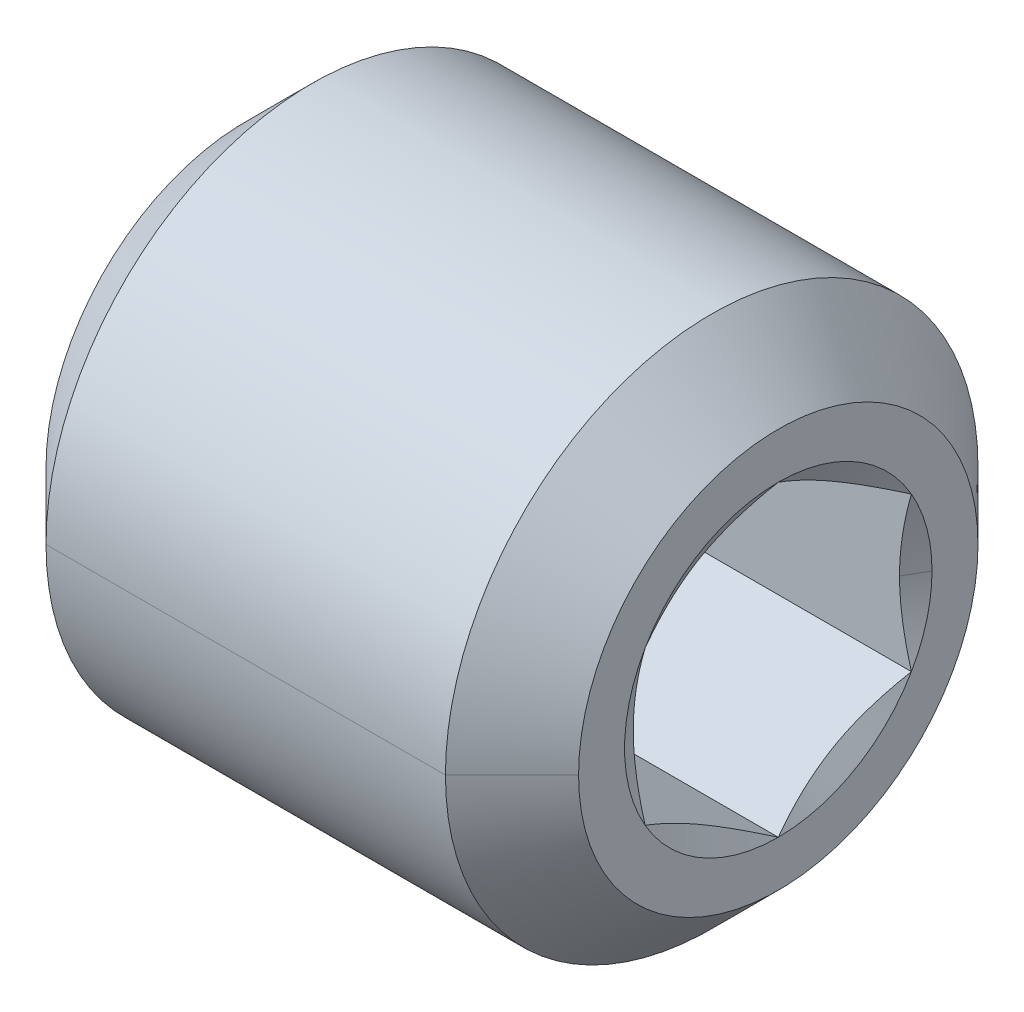
ISO-10303-21;
HEADER;
FILE_DESCRIPTION(('STEP AP214'),'2;1');
FILE_NAME('part.step','',(''),(''),'','','');
FILE_SCHEMA(('AUTOMOTIVE_DESIGN { 1 0 10303 214 1 1 1 1 }'));
ENDSEC;
DATA;
#1=APPLICATION_CONTEXT('core data for automotive mechanical design processes');
#2=APPLICATION_PROTOCOL_DEFINITION('international standard','automotive_design',2000,#1);
#3=PRODUCT_CONTEXT('',#1,'mechanical');
#4=PRODUCT('Part','Part','',(#3));
#5=PRODUCT_RELATED_PRODUCT_CATEGORY('part','',(#4));
#6=PRODUCT_DEFINITION_FORMATION('','',#4);
#7=PRODUCT_DEFINITION_CONTEXT('part definition',#1,'design');
#8=PRODUCT_DEFINITION('design','',#6,#7);
#9=PRODUCT_DEFINITION_SHAPE('','',#8);
#10=(LENGTH_UNIT() NAMED_UNIT(*) SI_UNIT(.MILLI.,.METRE.));
#11=(NAMED_UNIT(*) PLANE_ANGLE_UNIT() SI_UNIT($,.RADIAN.));
#12=(NAMED_UNIT(*) SI_UNIT($,.STERADIAN.) SOLID_ANGLE_UNIT());
#13=UNCERTAINTY_MEASURE_WITH_UNIT(LENGTH_MEASURE(1.E-05),#10,'distance_accuracy_value','');
#14=(GEOMETRIC_REPRESENTATION_CONTEXT(3) GLOBAL_UNCERTAINTY_ASSIGNED_CONTEXT((#13)) GLOBAL_UNIT_ASSIGNED_CONTEXT((#10,
#11,#12)) REPRESENTATION_CONTEXT('',''));
#15=CARTESIAN_POINT('',(0.,0.,0.));
#16=DIRECTION('',(0.,0.,1.));
#17=DIRECTION('',(1.,0.,0.));
#18=AXIS2_PLACEMENT_3D('',#15,#16,#17);
#19=CARTESIAN_POINT('',(0.,0.433012701892219,0.75));
#20=DIRECTION('',(0.,0.,1.));
#21=DIRECTION('',(1.,0.,0.));
#22=AXIS2_PLACEMENT_3D('',#19,#20,#21);
#23=PLANE('',#22);
#24=DIRECTION('',(1.,0.,0.));
#25=VECTOR('',#24,1.);
#26=CARTESIAN_POINT('',(0.,0.433012701892219,0.75));
#27=LINE('',#26,#25);
#28=CARTESIAN_POINT('',(0.,0.433012701892219,0.75));
#29=VERTEX_POINT('',#28);
#30=CARTESIAN_POINT('',(1.5,0.433012701892219,0.75));
#31=VERTEX_POINT('',#30);
#32=EDGE_CURVE('E10',#29,#31,#27,.T.);
#33=ORIENTED_EDGE('',*,*,#32,.T.);
#34=CARTESIAN_POINT('',(1.5,0.433012701892219,0.75));
#35=CARTESIAN_POINT('',(1.43344674432332,0.202465461409954,0.75));
#36=CARTESIAN_POINT('',(1.43301270588847,0.000101895172578551,0.75));
#37=CARTESIAN_POINT('',(1.43258463578709,-0.19947902983719,0.75));
#38=CARTESIAN_POINT('',(1.5,-0.433012701892219,0.75));
#39=B_SPLINE_CURVE_WITH_KNOTS('',2,(#34,#35,#36,#37,#38),.UNSPECIFIED.,.F.,.F.,(3,2,3),(0.,0.5,
1.),.UNSPECIFIED.);
#40=CARTESIAN_POINT('',(1.5,-0.43301270189222,0.75));
#41=VERTEX_POINT('',#40);
#42=EDGE_CURVE('E332',#31,#41,#39,.T.);
#43=ORIENTED_EDGE('',*,*,#42,.T.);
#44=DIRECTION('',(1.,0.,0.));
#45=VECTOR('',#44,1.);
#46=CARTESIAN_POINT('',(0.,-0.433012701892218,0.75));
#47=LINE('',#46,#45);
#48=CARTESIAN_POINT('',(0.,-0.433012701892218,0.75));
#49=VERTEX_POINT('',#48);
#50=EDGE_CURVE('E288',#49,#41,#47,.T.);
#51=ORIENTED_EDGE('',*,*,#50,.F.);
#52=DIRECTION('',(0.,-1.,0.));
#53=VECTOR('',#52,1.);
#54=CARTESIAN_POINT('',(0.,0.433012701892219,0.75));
#55=LINE('',#54,#53);
#56=EDGE_CURVE('E350',#29,#49,#55,.T.);
#57=ORIENTED_EDGE('',*,*,#56,.F.);
#58=EDGE_LOOP('',(#33,#43,#51,#57));
#59=FACE_BOUND('',#58,.T.);
#60=ADVANCED_FACE('F16',(#59),#23,.F.);
#61=CARTESIAN_POINT('',(0.,0.866025403784439,0.));
#62=DIRECTION('',(0.,0.866025403784438,0.5));
#63=DIRECTION('',(1.,0.,0.));
#64=AXIS2_PLACEMENT_3D('',#61,#62,#63);
#65=PLANE('',#64);
#66=DIRECTION('',(1.,0.,0.));
#67=VECTOR('',#66,1.);
#68=CARTESIAN_POINT('',(0.,0.866025403784439,0.));
#69=LINE('',#68,#67);
#70=CARTESIAN_POINT('',(0.,0.866025403784439,0.));
#71=VERTEX_POINT('',#70);
#72=CARTESIAN_POINT('',(1.5,0.866025403784439,0.));
#73=VERTEX_POINT('',#72);
#74=EDGE_CURVE('E28',#71,#73,#69,.T.);
#75=ORIENTED_EDGE('',*,*,#74,.T.);
#76=CARTESIAN_POINT('',(1.5,0.866025403784439,0.));
#77=CARTESIAN_POINT('',(1.43354683042407,0.750925137768686,0.19935950870398));
#78=CARTESIAN_POINT('',(1.43301296326796,0.649931082659289,0.374286343415866));
#79=CARTESIAN_POINT('',(1.4324844668569,0.549953035589004,0.547453400583113));
#80=CARTESIAN_POINT('',(1.5,0.433012701892219,0.750000000000003));
#81=B_SPLINE_CURVE_WITH_KNOTS('',2,(#76,#77,#78,#79,#80),.UNSPECIFIED.,.F.,.F.,(3,2,3),(0.,0.5,
1.),.UNSPECIFIED.);
#82=EDGE_CURVE('E305',#73,#31,#81,.T.);
#83=ORIENTED_EDGE('',*,*,#82,.T.);
#84=ORIENTED_EDGE('',*,*,#32,.F.);
#85=DIRECTION('',(0.,-0.5,0.866025403784438));
#86=VECTOR('',#85,1.);
#87=CARTESIAN_POINT('',(0.,0.866025403784439,0.));
#88=LINE('',#87,#86);
#89=EDGE_CURVE('E292',#71,#29,#88,.T.);
#90=ORIENTED_EDGE('',*,*,#89,.F.);
#91=EDGE_LOOP('',(#75,#83,#84,#90));
#92=FACE_BOUND('',#91,.T.);
#93=ADVANCED_FACE('F310',(#92),#65,.F.);
#94=CARTESIAN_POINT('',(0.,0.433012701892219,-0.75));
#95=DIRECTION('',(0.,0.866025403784439,-0.5));
#96=DIRECTION('',(-1.,0.,0.));
#97=AXIS2_PLACEMENT_3D('',#94,#95,#96);
#98=PLANE('',#97);
#99=DIRECTION('',(1.,0.,0.));
#100=VECTOR('',#99,1.);
#101=CARTESIAN_POINT('',(0.,0.433012701892219,-0.75));
#102=LINE('',#101,#100);
#103=CARTESIAN_POINT('',(0.,0.433012701892219,-0.75));
#104=VERTEX_POINT('',#103);
#105=CARTESIAN_POINT('',(1.5,0.43301270189222,-0.75));
#106=VERTEX_POINT('',#105);
#107=EDGE_CURVE('E52',#104,#106,#102,.T.);
#108=ORIENTED_EDGE('',*,*,#107,.T.);
#109=CARTESIAN_POINT('',(1.5,0.433012701892219,-0.75));
#110=CARTESIAN_POINT('',(1.43354683042406,0.548112967907988,-0.550640491295995));
#111=CARTESIAN_POINT('',(1.43301296326796,0.649107023017369,-0.375713656584135));
#112=CARTESIAN_POINT('',(1.43248446685691,0.749085070087671,-0.202546599416861));
#113=CARTESIAN_POINT('',(1.5,0.86602540378444,0.));
#114=B_SPLINE_CURVE_WITH_KNOTS('',2,(#109,#110,#111,#112,#113),.UNSPECIFIED.,.F.,.F.,(3,2,3),
(0.,0.5,1.),.UNSPECIFIED.);
#115=EDGE_CURVE('E144',#106,#73,#114,.T.);
#116=ORIENTED_EDGE('',*,*,#115,.T.);
#117=ORIENTED_EDGE('',*,*,#74,.F.);
#118=DIRECTION('',(0.,0.5,0.866025403784439));
#119=VECTOR('',#118,1.);
#120=CARTESIAN_POINT('',(0.,0.433012701892219,-0.75));
#121=LINE('',#120,#119);
#122=EDGE_CURVE('E369',#104,#71,#121,.T.);
#123=ORIENTED_EDGE('',*,*,#122,.F.);
#124=EDGE_LOOP('',(#108,#116,#117,#123));
#125=FACE_BOUND('',#124,.T.);
#126=ADVANCED_FACE('F176',(#125),#98,.F.);
#127=CARTESIAN_POINT('',(0.,-0.43301270189222,-0.75));
#128=DIRECTION('',(0.,0.,-1.));
#129=DIRECTION('',(0.,-1.,0.));
#130=AXIS2_PLACEMENT_3D('',#127,#128,#129);
#131=PLANE('',#130);
#132=DIRECTION('',(1.,0.,0.));
#133=VECTOR('',#132,1.);
#134=CARTESIAN_POINT('',(0.,-0.43301270189222,-0.75));
#135=LINE('',#134,#133);
#136=CARTESIAN_POINT('',(0.,-0.43301270189222,-0.75));
#137=VERTEX_POINT('',#136);
#138=CARTESIAN_POINT('',(1.5,-0.433012701892221,-0.75));
#139=VERTEX_POINT('',#138);
#140=EDGE_CURVE('E139',#137,#139,#135,.T.);
#141=ORIENTED_EDGE('',*,*,#140,.T.);
#142=CARTESIAN_POINT('',(1.5,-0.433012701892221,-0.75));
#143=CARTESIAN_POINT('',(1.43301270188743,-0.200961894306797,-0.75));
#144=CARTESIAN_POINT('',(1.43301270188743,4.89029389899587E-13,-0.75));
#145=B_SPLINE_CURVE_WITH_KNOTS('',2,(#142,#143,#144),.UNSPECIFIED.,.F.,.F.,(3,3),(0.,1.),.UNSPECIFIED.);
#146=CARTESIAN_POINT('',(1.43301270188743,4.88848278290878E-13,-0.75));
#147=VERTEX_POINT('',#146);
#148=EDGE_CURVE('E132',#139,#147,#145,.T.);
#149=ORIENTED_EDGE('',*,*,#148,.T.);
#150=CARTESIAN_POINT('',(1.43301270188743,4.89029389899587E-13,-0.75));
#151=CARTESIAN_POINT('',(1.43301270188743,0.200961894306776,-0.75));
#152=CARTESIAN_POINT('',(1.5,0.43301270189222,-0.75));
#153=B_SPLINE_CURVE_WITH_KNOTS('',2,(#150,#151,#152),.UNSPECIFIED.,.F.,.F.,(3,3),(0.,1.),.UNSPECIFIED.);
#154=EDGE_CURVE('E137',#147,#106,#153,.T.);
#155=ORIENTED_EDGE('',*,*,#154,.T.);
#156=ORIENTED_EDGE('',*,*,#107,.F.);
#157=DIRECTION('',(0.,1.,0.));
#158=VECTOR('',#157,1.);
#159=CARTESIAN_POINT('',(0.,-0.43301270189222,-0.75));
#160=LINE('',#159,#158);
#161=EDGE_CURVE('E366',#137,#104,#160,.T.);
#162=ORIENTED_EDGE('',*,*,#161,.F.);
#163=EDGE_LOOP('',(#141,#149,#155,#156,#162));
#164=FACE_BOUND('',#163,.T.);
#165=ADVANCED_FACE('F135',(#164),#131,.F.);
#166=CARTESIAN_POINT('',(0.,-0.866025403784441,0.));
#167=DIRECTION('',(0.,-0.866025403784438,-0.5));
#168=DIRECTION('',(0.,0.5,-0.866025403784438));
#169=AXIS2_PLACEMENT_3D('',#166,#167,#168);
#170=PLANE('',#169);
#171=DIRECTION('',(1.,0.,0.));
#172=VECTOR('',#171,1.);
#173=CARTESIAN_POINT('',(0.,-0.866025403784441,0.));
#174=LINE('',#173,#172);
#175=CARTESIAN_POINT('',(0.,-0.866025403784441,0.));
#176=VERTEX_POINT('',#175);
#177=CARTESIAN_POINT('',(1.5,-0.866025403784439,0.));
#178=VERTEX_POINT('',#177);
#179=EDGE_CURVE('E291',#176,#178,#174,.T.);
#180=ORIENTED_EDGE('',*,*,#179,.T.);
#181=CARTESIAN_POINT('',(1.5,-0.866025403784442,0.));
#182=CARTESIAN_POINT('',(1.43354683042407,-0.750925137768687,-0.19935950870398));
#183=CARTESIAN_POINT('',(1.43301296326796,-0.649931082659292,-0.374286343415862));
#184=CARTESIAN_POINT('',(1.4324844668569,-0.549953035589003,-0.547453400583115));
#185=CARTESIAN_POINT('',(1.5,-0.433012701892221,-0.75));
#186=B_SPLINE_CURVE_WITH_KNOTS('',2,(#181,#182,#183,#184,#185),.UNSPECIFIED.,.F.,.F.,(3,2,3),
(0.,0.5,1.),.UNSPECIFIED.);
#187=EDGE_CURVE('E145',#178,#139,#186,.T.);
#188=ORIENTED_EDGE('',*,*,#187,.T.);
#189=ORIENTED_EDGE('',*,*,#140,.F.);
#190=DIRECTION('',(0.,0.5,-0.866025403784438));
#191=VECTOR('',#190,1.);
#192=CARTESIAN_POINT('',(0.,-0.866025403784441,0.));
#193=LINE('',#192,#191);
#194=EDGE_CURVE('E363',#176,#137,#193,.T.);
#195=ORIENTED_EDGE('',*,*,#194,.F.);
#196=EDGE_LOOP('',(#180,#188,#189,#195));
#197=FACE_BOUND('',#196,.T.);
#198=ADVANCED_FACE('F175',(#197),#170,.F.);
#199=CARTESIAN_POINT('',(0.,-0.433012701892218,0.75));
#200=DIRECTION('',(0.,-0.866025403784438,0.5));
#201=DIRECTION('',(-1.,0.,0.));
#202=AXIS2_PLACEMENT_3D('',#199,#200,#201);
#203=PLANE('',#202);
#204=ORIENTED_EDGE('',*,*,#50,.T.);
#205=CARTESIAN_POINT('',(1.5,-0.43301270189222,0.749999999999997));
#206=CARTESIAN_POINT('',(1.43354683042408,-0.548112967907957,0.550640491296046));
#207=CARTESIAN_POINT('',(1.43301296326796,-0.649107023017368,0.375713656584136));
#208=CARTESIAN_POINT('',(1.43248446685689,-0.74908507008764,0.202546599416912));
#209=CARTESIAN_POINT('',(1.5,-0.866025403784438,0.));
#210=B_SPLINE_CURVE_WITH_KNOTS('',2,(#205,#206,#207,#208,#209),.UNSPECIFIED.,.F.,.F.,(3,2,3),
(0.,0.5,1.),.UNSPECIFIED.);
#211=EDGE_CURVE('E235',#41,#178,#210,.T.);
#212=ORIENTED_EDGE('',*,*,#211,.T.);
#213=ORIENTED_EDGE('',*,*,#179,.F.);
#214=DIRECTION('',(0.,-0.5,-0.866025403784438));
#215=VECTOR('',#214,1.);
#216=CARTESIAN_POINT('',(0.,-0.433012701892218,0.75));
#217=LINE('',#216,#215);
#218=EDGE_CURVE('E355',#49,#176,#217,.T.);
#219=ORIENTED_EDGE('',*,*,#218,.F.);
#220=EDGE_LOOP('',(#204,#212,#213,#219));
#221=FACE_BOUND('',#220,.T.);
#222=ADVANCED_FACE('F241',(#221),#203,.F.);
#223=CARTESIAN_POINT('',(0.,0.,0.));
#224=DIRECTION('',(1.,0.,0.));
#225=DIRECTION('',(0.,1.,0.));
#226=AXIS2_PLACEMENT_3D('',#223,#224,#225);
#227=PLANE('',#226);
#228=ORIENTED_EDGE('',*,*,#56,.T.);
#229=ORIENTED_EDGE('',*,*,#218,.T.);
#230=ORIENTED_EDGE('',*,*,#194,.T.);
#231=ORIENTED_EDGE('',*,*,#161,.T.);
#232=ORIENTED_EDGE('',*,*,#122,.T.);
#233=ORIENTED_EDGE('',*,*,#89,.T.);
#234=EDGE_LOOP('',(#228,#229,#230,#231,#232,#233));
#235=FACE_BOUND('',#234,.T.);
#236=ADVANCED_FACE('F250',(#235),#227,.T.);
#237=CARTESIAN_POINT('',(1.5,0.,0.));
#238=DIRECTION('',(1.,0.,0.));
#239=DIRECTION('',(0.,0.,-1.));
#240=AXIS2_PLACEMENT_3D('',#237,#238,#239);
#241=CONICAL_SURFACE('',#240,0.866025403784439,1.0471975511966);
#242=CARTESIAN_POINT('',(1.5,0.,0.));
#243=DIRECTION('',(1.,0.,0.));
#244=DIRECTION('',(0.,0.,-1.));
#245=AXIS2_PLACEMENT_3D('',#242,#243,#244);
#246=CIRCLE('',#245,0.866025403784439);
#247=EDGE_CURVE('E279',#31,#41,#246,.T.);
#248=ORIENTED_EDGE('',*,*,#247,.T.);
#249=ORIENTED_EDGE('',*,*,#42,.F.);
#250=EDGE_LOOP('',(#248,#249));
#251=FACE_BOUND('',#250,.T.);
#252=ADVANCED_FACE('F252',(#251),#241,.F.);
#253=CARTESIAN_POINT('',(1.5,0.,0.));
#254=DIRECTION('',(1.,0.,0.));
#255=DIRECTION('',(0.,0.,-1.));
#256=AXIS2_PLACEMENT_3D('',#253,#254,#255);
#257=CONICAL_SURFACE('',#256,0.866025403784439,1.0471975511966);
#258=CARTESIAN_POINT('',(1.5,0.,0.));
#259=DIRECTION('',(1.,0.,0.));
#260=DIRECTION('',(0.,0.,-1.));
#261=AXIS2_PLACEMENT_3D('',#258,#259,#260);
#262=CIRCLE('',#261,0.866025403784439);
#263=EDGE_CURVE('E274',#73,#31,#262,.T.);
#264=ORIENTED_EDGE('',*,*,#263,.T.);
#265=ORIENTED_EDGE('',*,*,#82,.F.);
#266=EDGE_LOOP('',(#264,#265));
#267=FACE_BOUND('',#266,.T.);
#268=ADVANCED_FACE('F256',(#267),#257,.F.);
#269=CARTESIAN_POINT('',(1.5,0.,0.));
#270=DIRECTION('',(1.,0.,0.));
#271=DIRECTION('',(0.,0.,-1.));
#272=AXIS2_PLACEMENT_3D('',#269,#270,#271);
#273=CONICAL_SURFACE('',#272,0.866025403784439,1.0471975511966);
#274=CARTESIAN_POINT('',(1.5,0.,0.));
#275=DIRECTION('',(1.,0.,0.));
#276=DIRECTION('',(0.,0.,-1.));
#277=AXIS2_PLACEMENT_3D('',#274,#275,#276);
#278=CIRCLE('',#277,0.866025403784439);
#279=EDGE_CURVE('E278',#106,#73,#278,.T.);
#280=ORIENTED_EDGE('',*,*,#279,.T.);
#281=ORIENTED_EDGE('',*,*,#115,.F.);
#282=EDGE_LOOP('',(#280,#281));
#283=FACE_BOUND('',#282,.T.);
#284=ADVANCED_FACE('F204',(#283),#273,.F.);
#285=CARTESIAN_POINT('',(1.5,0.,0.));
#286=DIRECTION('',(1.,0.,0.));
#287=DIRECTION('',(0.,0.,-1.));
#288=AXIS2_PLACEMENT_3D('',#285,#286,#287);
#289=CONICAL_SURFACE('',#288,0.866025403784439,1.0471975511966);
#290=DIRECTION('',(0.5,0.,-0.86602540378444));
#291=VECTOR('',#290,1.);
#292=CARTESIAN_POINT('',(1.5,0.,-0.866025403784439));
#293=LINE('',#292,#291);
#294=CARTESIAN_POINT('',(1.5,0.,-0.866025403784439));
#295=VERTEX_POINT('',#294);
#296=EDGE_CURVE('E149',#147,#295,#293,.T.);
#297=ORIENTED_EDGE('',*,*,#296,.F.);
#298=ORIENTED_EDGE('',*,*,#148,.F.);
#299=CARTESIAN_POINT('',(1.5,0.,0.));
#300=DIRECTION('',(1.,0.,0.));
#301=DIRECTION('',(0.,0.,-1.));
#302=AXIS2_PLACEMENT_3D('',#299,#300,#301);
#303=CIRCLE('',#302,0.866025403784439);
#304=EDGE_CURVE('E152',#139,#295,#303,.T.);
#305=ORIENTED_EDGE('',*,*,#304,.T.);
#306=EDGE_LOOP('',(#297,#298,#305));
#307=FACE_BOUND('',#306,.T.);
#308=ADVANCED_FACE('F150',(#307),#289,.F.);
#309=CARTESIAN_POINT('',(1.5,0.,0.));
#310=DIRECTION('',(1.,0.,0.));
#311=DIRECTION('',(0.,0.,-1.));
#312=AXIS2_PLACEMENT_3D('',#309,#310,#311);
#313=CONICAL_SURFACE('',#312,0.866025403784439,1.0471975511966);
#314=CARTESIAN_POINT('',(1.5,0.,0.));
#315=DIRECTION('',(1.,0.,0.));
#316=DIRECTION('',(0.,0.,-1.));
#317=AXIS2_PLACEMENT_3D('',#314,#315,#316);
#318=CIRCLE('',#317,0.866025403784439);
#319=EDGE_CURVE('E298',#178,#139,#318,.T.);
#320=ORIENTED_EDGE('',*,*,#319,.T.);
#321=ORIENTED_EDGE('',*,*,#187,.F.);
#322=EDGE_LOOP('',(#320,#321));
#323=FACE_BOUND('',#322,.T.);
#324=ADVANCED_FACE('F203',(#323),#313,.F.);
#325=CARTESIAN_POINT('',(1.5,0.,0.));
#326=DIRECTION('',(1.,0.,0.));
#327=DIRECTION('',(0.,0.,-1.));
#328=AXIS2_PLACEMENT_3D('',#325,#326,#327);
#329=CONICAL_SURFACE('',#328,0.866025403784439,1.0471975511966);
#330=CARTESIAN_POINT('',(1.5,0.,0.));
#331=DIRECTION('',(1.,0.,0.));
#332=DIRECTION('',(0.,0.,-1.));
#333=AXIS2_PLACEMENT_3D('',#330,#331,#332);
#334=CIRCLE('',#333,0.866025403784439);
#335=EDGE_CURVE('E295',#41,#178,#334,.T.);
#336=ORIENTED_EDGE('',*,*,#335,.T.);
#337=ORIENTED_EDGE('',*,*,#211,.F.);
#338=EDGE_LOOP('',(#336,#337));
#339=FACE_BOUND('',#338,.T.);
#340=ADVANCED_FACE('F216',(#339),#329,.F.);
#341=CARTESIAN_POINT('',(1.5,1.125,0.));
#342=DIRECTION('',(-1.,0.,0.));
#343=DIRECTION('',(0.,0.,1.));
#344=AXIS2_PLACEMENT_3D('',#341,#342,#343);
#345=PLANE('',#344);
#346=ORIENTED_EDGE('',*,*,#247,.F.);
#347=ORIENTED_EDGE('',*,*,#263,.F.);
#348=ORIENTED_EDGE('',*,*,#279,.F.);
#349=CARTESIAN_POINT('',(1.5,0.,0.));
#350=DIRECTION('',(1.,0.,0.));
#351=DIRECTION('',(0.,0.,-1.));
#352=AXIS2_PLACEMENT_3D('',#349,#350,#351);
#353=CIRCLE('',#352,0.866025403784439);
#354=EDGE_CURVE('E157',#295,#106,#353,.T.);
#355=ORIENTED_EDGE('',*,*,#354,.F.);
#356=ORIENTED_EDGE('',*,*,#304,.F.);
#357=ORIENTED_EDGE('',*,*,#319,.F.);
#358=ORIENTED_EDGE('',*,*,#335,.F.);
#359=EDGE_LOOP('',(#346,#347,#348,#355,#356,#357,#358));
#360=FACE_BOUND('',#359,.T.);
#361=CARTESIAN_POINT('',(1.5,0.,0.));
#362=DIRECTION('',(-1.,0.,0.));
#363=DIRECTION('',(0.,0.,1.));
#364=AXIS2_PLACEMENT_3D('',#361,#362,#363);
#365=CIRCLE('',#364,1.125);
#366=CARTESIAN_POINT('',(1.5,0.,1.125));
#367=VERTEX_POINT('',#366);
#368=CARTESIAN_POINT('',(1.5,0.,-1.125));
#369=VERTEX_POINT('',#368);
#370=EDGE_CURVE('E431',#367,#369,#365,.T.);
#371=ORIENTED_EDGE('',*,*,#370,.F.);
#372=CARTESIAN_POINT('',(1.5,0.,0.));
#373=DIRECTION('',(-1.,0.,0.));
#374=DIRECTION('',(0.,0.,1.));
#375=AXIS2_PLACEMENT_3D('',#372,#373,#374);
#376=CIRCLE('',#375,1.125);
#377=EDGE_CURVE('E285',#369,#367,#376,.T.);
#378=ORIENTED_EDGE('',*,*,#377,.F.);
#379=EDGE_LOOP('',(#371,#378));
#380=FACE_BOUND('',#379,.T.);
#381=ADVANCED_FACE('F220',(#360,#380),#345,.F.);
#382=CARTESIAN_POINT('',(1.5,0.,0.));
#383=DIRECTION('',(-1.,0.,0.));
#384=DIRECTION('',(0.,0.,1.));
#385=AXIS2_PLACEMENT_3D('',#382,#383,#384);
#386=CONICAL_SURFACE('',#385,1.125,0.78539816339745);
#387=DIRECTION('',(-0.707106781186546,0.,-0.707106781186549));
#388=VECTOR('',#387,1.);
#389=CARTESIAN_POINT('',(1.5,0.,-1.125));
#390=LINE('',#389,#388);
#391=CARTESIAN_POINT('',(1.125,0.,-1.5));
#392=VERTEX_POINT('',#391);
#393=EDGE_CURVE('E423',#369,#392,#390,.T.);
#394=ORIENTED_EDGE('',*,*,#393,.F.);
#395=ORIENTED_EDGE('',*,*,#377,.T.);
#396=DIRECTION('',(-0.707106781186546,0.,0.707106781186549));
#397=VECTOR('',#396,1.);
#398=CARTESIAN_POINT('',(1.5,0.,1.125));
#399=LINE('',#398,#397);
#400=CARTESIAN_POINT('',(1.125,0.,1.5));
#401=VERTEX_POINT('',#400);
#402=EDGE_CURVE('E415',#367,#401,#399,.T.);
#403=ORIENTED_EDGE('',*,*,#402,.T.);
#404=CARTESIAN_POINT('',(1.125,0.,0.));
#405=DIRECTION('',(-1.,0.,0.));
#406=DIRECTION('',(0.,0.,1.));
#407=AXIS2_PLACEMENT_3D('',#404,#405,#406);
#408=CIRCLE('',#407,1.5);
#409=EDGE_CURVE('E440',#392,#401,#408,.T.);
#410=ORIENTED_EDGE('',*,*,#409,.F.);
#411=EDGE_LOOP('',(#394,#395,#403,#410));
#412=FACE_BOUND('',#411,.T.);
#413=ADVANCED_FACE('F449',(#412),#386,.T.);
#414=CARTESIAN_POINT('',(-1.5,0.,0.));
#415=DIRECTION('',(-1.,0.,0.));
#416=DIRECTION('',(0.,0.,1.));
#417=AXIS2_PLACEMENT_3D('',#414,#415,#416);
#418=CYLINDRICAL_SURFACE('',#417,1.5);
#419=DIRECTION('',(-1.,0.,0.));
#420=VECTOR('',#419,1.);
#421=CARTESIAN_POINT('',(-1.5,0.,-1.5));
#422=LINE('',#421,#420);
#423=CARTESIAN_POINT('',(-1.125,0.,-1.5));
#424=VERTEX_POINT('',#423);
#425=EDGE_CURVE('E407',#392,#424,#422,.T.);
#426=ORIENTED_EDGE('',*,*,#425,.F.);
#427=ORIENTED_EDGE('',*,*,#409,.T.);
#428=DIRECTION('',(-1.,0.,0.));
#429=VECTOR('',#428,1.);
#430=CARTESIAN_POINT('',(-1.5,0.,1.5));
#431=LINE('',#430,#429);
#432=CARTESIAN_POINT('',(-1.125,0.,1.5));
#433=VERTEX_POINT('',#432);
#434=EDGE_CURVE('E399',#401,#433,#431,.T.);
#435=ORIENTED_EDGE('',*,*,#434,.T.);
#436=CARTESIAN_POINT('',(-1.125,0.,0.));
#437=DIRECTION('',(-1.,0.,0.));
#438=DIRECTION('',(0.,0.,1.));
#439=AXIS2_PLACEMENT_3D('',#436,#437,#438);
#440=CIRCLE('',#439,1.5);
#441=EDGE_CURVE('E437',#424,#433,#440,.T.);
#442=ORIENTED_EDGE('',*,*,#441,.F.);
#443=EDGE_LOOP('',(#426,#427,#435,#442));
#444=FACE_BOUND('',#443,.T.);
#445=ADVANCED_FACE('F459',(#444),#418,.T.);
#446=CARTESIAN_POINT('',(-1.125,0.,0.));
#447=DIRECTION('',(1.,0.,0.));
#448=DIRECTION('',(0.,0.,-1.));
#449=AXIS2_PLACEMENT_3D('',#446,#447,#448);
#450=CONICAL_SURFACE('',#449,1.5,0.785398163397446);
#451=DIRECTION('',(0.707106781186549,0.,0.707106781186546));
#452=VECTOR('',#451,1.);
#453=CARTESIAN_POINT('',(-1.125,0.,1.5));
#454=LINE('',#453,#452);
#455=CARTESIAN_POINT('',(-1.5,0.,1.125));
#456=VERTEX_POINT('',#455);
#457=EDGE_CURVE('E398',#456,#433,#454,.T.);
#458=ORIENTED_EDGE('',*,*,#457,.F.);
#459=CARTESIAN_POINT('',(-1.5,0.,0.));
#460=DIRECTION('',(-1.,0.,0.));
#461=DIRECTION('',(0.,0.,1.));
#462=AXIS2_PLACEMENT_3D('',#459,#460,#461);
#463=CIRCLE('',#462,1.125);
#464=CARTESIAN_POINT('',(-1.5,0.,-1.125));
#465=VERTEX_POINT('',#464);
#466=EDGE_CURVE('E427',#465,#456,#463,.T.);
#467=ORIENTED_EDGE('',*,*,#466,.F.);
#468=DIRECTION('',(0.707106781186549,0.,-0.707106781186546));
#469=VECTOR('',#468,1.);
#470=CARTESIAN_POINT('',(-1.125,0.,-1.5));
#471=LINE('',#470,#469);
#472=EDGE_CURVE('E411',#465,#424,#471,.T.);
#473=ORIENTED_EDGE('',*,*,#472,.T.);
#474=ORIENTED_EDGE('',*,*,#441,.T.);
#475=EDGE_LOOP('',(#458,#467,#473,#474));
#476=FACE_BOUND('',#475,.T.);
#477=ADVANCED_FACE('F214',(#476),#450,.T.);
#478=CARTESIAN_POINT('',(-1.5,0.,0.));
#479=DIRECTION('',(1.,0.,0.));
#480=DIRECTION('',(0.,1.,0.));
#481=AXIS2_PLACEMENT_3D('',#478,#479,#480);
#482=PLANE('',#481);
#483=ORIENTED_EDGE('',*,*,#466,.T.);
#484=CARTESIAN_POINT('',(-1.5,0.,0.));
#485=DIRECTION('',(-1.,0.,0.));
#486=DIRECTION('',(0.,0.,1.));
#487=AXIS2_PLACEMENT_3D('',#484,#485,#486);
#488=CIRCLE('',#487,1.125);
#489=EDGE_CURVE('E394',#456,#465,#488,.T.);
#490=ORIENTED_EDGE('',*,*,#489,.T.);
#491=EDGE_LOOP('',(#483,#490));
#492=FACE_BOUND('',#491,.T.);
#493=ADVANCED_FACE('F210',(#492),#482,.F.);
#494=CARTESIAN_POINT('',(-1.125,0.,0.));
#495=DIRECTION('',(1.,0.,0.));
#496=DIRECTION('',(0.,0.,-1.));
#497=AXIS2_PLACEMENT_3D('',#494,#495,#496);
#498=CONICAL_SURFACE('',#497,1.5,0.785398163397446);
#499=ORIENTED_EDGE('',*,*,#489,.F.);
#500=ORIENTED_EDGE('',*,*,#457,.T.);
#501=CARTESIAN_POINT('',(-1.125,0.,0.));
#502=DIRECTION('',(-1.,0.,0.));
#503=DIRECTION('',(0.,0.,1.));
#504=AXIS2_PLACEMENT_3D('',#501,#502,#503);
#505=CIRCLE('',#504,1.5);
#506=EDGE_CURVE('E403',#433,#424,#505,.T.);
#507=ORIENTED_EDGE('',*,*,#506,.T.);
#508=ORIENTED_EDGE('',*,*,#472,.F.);
#509=EDGE_LOOP('',(#499,#500,#507,#508));
#510=FACE_BOUND('',#509,.T.);
#511=ADVANCED_FACE('F207',(#510),#498,.T.);
#512=CARTESIAN_POINT('',(-1.5,0.,0.));
#513=DIRECTION('',(-1.,0.,0.));
#514=DIRECTION('',(0.,0.,1.));
#515=AXIS2_PLACEMENT_3D('',#512,#513,#514);
#516=CYLINDRICAL_SURFACE('',#515,1.5);
#517=CARTESIAN_POINT('',(1.125,0.,0.));
#518=DIRECTION('',(-1.,0.,0.));
#519=DIRECTION('',(0.,0.,1.));
#520=AXIS2_PLACEMENT_3D('',#517,#518,#519);
#521=CIRCLE('',#520,1.5);
#522=EDGE_CURVE('E419',#401,#392,#521,.T.);
#523=ORIENTED_EDGE('',*,*,#522,.T.);
#524=ORIENTED_EDGE('',*,*,#425,.T.);
#525=ORIENTED_EDGE('',*,*,#506,.F.);
#526=ORIENTED_EDGE('',*,*,#434,.F.);
#527=EDGE_LOOP('',(#523,#524,#525,#526));
#528=FACE_BOUND('',#527,.T.);
#529=ADVANCED_FACE('F205',(#528),#516,.T.);
#530=CARTESIAN_POINT('',(1.5,0.,0.));
#531=DIRECTION('',(-1.,0.,0.));
#532=DIRECTION('',(0.,0.,1.));
#533=AXIS2_PLACEMENT_3D('',#530,#531,#532);
#534=CONICAL_SURFACE('',#533,1.125,0.78539816339745);
#535=ORIENTED_EDGE('',*,*,#370,.T.);
#536=ORIENTED_EDGE('',*,*,#393,.T.);
#537=ORIENTED_EDGE('',*,*,#522,.F.);
#538=ORIENTED_EDGE('',*,*,#402,.F.);
#539=EDGE_LOOP('',(#535,#536,#537,#538));
#540=FACE_BOUND('',#539,.T.);
#541=ADVANCED_FACE('F453',(#540),#534,.T.);
#542=CARTESIAN_POINT('',(1.5,0.,0.));
#543=DIRECTION('',(1.,0.,0.));
#544=DIRECTION('',(0.,0.,-1.));
#545=AXIS2_PLACEMENT_3D('',#542,#543,#544);
#546=CONICAL_SURFACE('',#545,0.866025403784439,1.0471975511966);
#547=ORIENTED_EDGE('',*,*,#154,.F.);
#548=ORIENTED_EDGE('',*,*,#296,.T.);
#549=ORIENTED_EDGE('',*,*,#354,.T.);
#550=EDGE_LOOP('',(#547,#548,#549));
#551=FACE_BOUND('',#550,.T.);
#552=ADVANCED_FACE('F159',(#551),#546,.F.);
#553=CLOSED_SHELL('',(#60,#93,#126,#165,#198,#222,#236,#252,#268,#284,#308,#324,#340,#381,#413,
#445,#477,#493,#511,#529,#541,#552));
#554=MANIFOLD_SOLID_BREP('B1',#553);
#555=ADVANCED_BREP_SHAPE_REPRESENTATION('',(#18,#554),#14);
#556=SHAPE_DEFINITION_REPRESENTATION(#9,#555);
ENDSEC;
END-ISO-10303-21;
